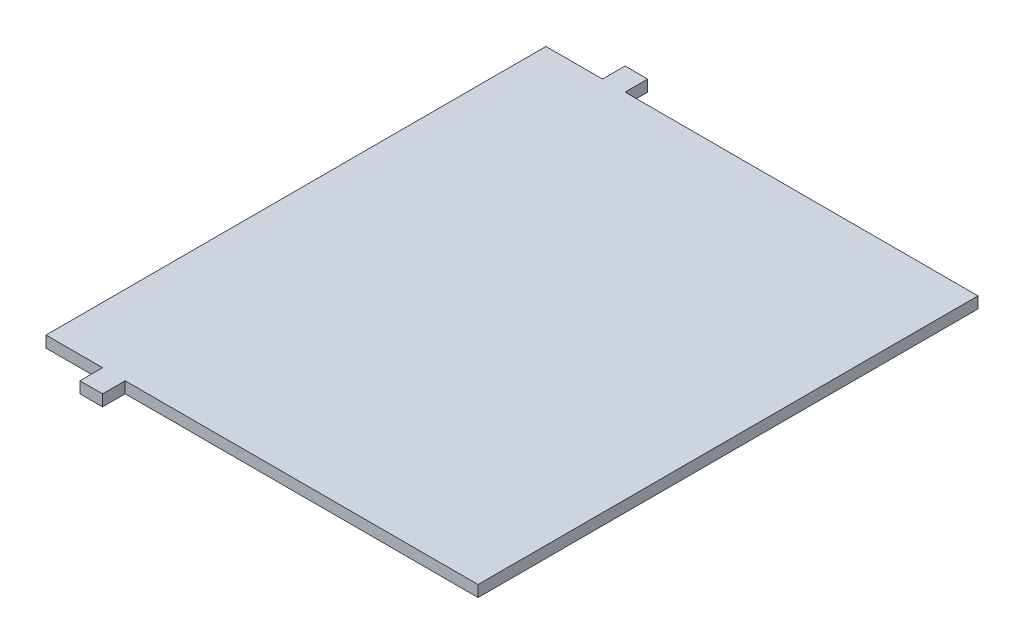
ISO-10303-21;
HEADER;
FILE_DESCRIPTION(('STEP AP214'),'2;1');
FILE_NAME('part.step','',(''),(''),'','','');
FILE_SCHEMA(('AUTOMOTIVE_DESIGN { 1 0 10303 214 1 1 1 1 }'));
ENDSEC;
DATA;
#1=APPLICATION_CONTEXT('core data for automotive mechanical design processes');
#2=APPLICATION_PROTOCOL_DEFINITION('international standard','automotive_design',2000,#1);
#3=PRODUCT_CONTEXT('',#1,'mechanical');
#4=PRODUCT('Part','Part','',(#3));
#5=PRODUCT_RELATED_PRODUCT_CATEGORY('part','',(#4));
#6=PRODUCT_DEFINITION_FORMATION('','',#4);
#7=PRODUCT_DEFINITION_CONTEXT('part definition',#1,'design');
#8=PRODUCT_DEFINITION('design','',#6,#7);
#9=PRODUCT_DEFINITION_SHAPE('','',#8);
#10=(LENGTH_UNIT() NAMED_UNIT(*) SI_UNIT(.MILLI.,.METRE.));
#11=(NAMED_UNIT(*) PLANE_ANGLE_UNIT() SI_UNIT($,.RADIAN.));
#12=(NAMED_UNIT(*) SI_UNIT($,.STERADIAN.) SOLID_ANGLE_UNIT());
#13=UNCERTAINTY_MEASURE_WITH_UNIT(LENGTH_MEASURE(1.E-05),#10,'distance_accuracy_value','');
#14=(GEOMETRIC_REPRESENTATION_CONTEXT(3) GLOBAL_UNCERTAINTY_ASSIGNED_CONTEXT((#13)) GLOBAL_UNIT_ASSIGNED_CONTEXT((#10,
#11,#12)) REPRESENTATION_CONTEXT('',''));
#15=CARTESIAN_POINT('',(0.,0.,0.));
#16=DIRECTION('',(0.,0.,1.));
#17=DIRECTION('',(1.,0.,0.));
#18=AXIS2_PLACEMENT_3D('',#15,#16,#17);
#19=CARTESIAN_POINT('',(-95.5,5.,-110.5));
#20=DIRECTION('',(0.,0.,1.));
#21=DIRECTION('',(1.,0.,0.));
#22=AXIS2_PLACEMENT_3D('',#19,#20,#21);
#23=PLANE('',#22);
#24=DIRECTION('',(-1.,0.,0.));
#25=VECTOR('',#24,1.);
#26=CARTESIAN_POINT('',(-95.5,5.,-110.5));
#27=LINE('',#26,#25);
#28=CARTESIAN_POINT('',(-70.5,5.,-110.5));
#29=VERTEX_POINT('',#28);
#30=CARTESIAN_POINT('',(-95.5,5.,-110.5));
#31=VERTEX_POINT('',#30);
#32=EDGE_CURVE('E204',#29,#31,#27,.T.);
#33=ORIENTED_EDGE('',*,*,#32,.F.);
#34=DIRECTION('',(0.,-1.,0.));
#35=VECTOR('',#34,1.);
#36=CARTESIAN_POINT('',(-70.5,5.,-110.5));
#37=LINE('',#36,#35);
#38=CARTESIAN_POINT('',(-70.5,0.,-110.5));
#39=VERTEX_POINT('',#38);
#40=EDGE_CURVE('E196',#29,#39,#37,.T.);
#41=ORIENTED_EDGE('',*,*,#40,.T.);
#42=DIRECTION('',(-1.,0.,0.));
#43=VECTOR('',#42,1.);
#44=CARTESIAN_POINT('',(-95.5,0.,-110.5));
#45=LINE('',#44,#43);
#46=CARTESIAN_POINT('',(-95.5,0.,-110.5));
#47=VERTEX_POINT('',#46);
#48=EDGE_CURVE('E142',#39,#47,#45,.T.);
#49=ORIENTED_EDGE('',*,*,#48,.T.);
#50=DIRECTION('',(0.,-1.,0.));
#51=VECTOR('',#50,1.);
#52=CARTESIAN_POINT('',(-95.5,5.,-110.5));
#53=LINE('',#52,#51);
#54=EDGE_CURVE('E52',#31,#47,#53,.T.);
#55=ORIENTED_EDGE('',*,*,#54,.F.);
#56=EDGE_LOOP('',(#33,#41,#49,#55));
#57=FACE_BOUND('',#56,.T.);
#58=ADVANCED_FACE('F43',(#57),#23,.F.);
#59=CARTESIAN_POINT('',(-95.5,5.,110.5));
#60=DIRECTION('',(0.,0.,-1.));
#61=DIRECTION('',(-1.,0.,0.));
#62=AXIS2_PLACEMENT_3D('',#59,#60,#61);
#63=PLANE('',#62);
#64=DIRECTION('',(1.,0.,0.));
#65=VECTOR('',#64,1.);
#66=CARTESIAN_POINT('',(-95.5,0.,110.5));
#67=LINE('',#66,#65);
#68=CARTESIAN_POINT('',(-95.5,0.,110.5));
#69=VERTEX_POINT('',#68);
#70=CARTESIAN_POINT('',(-70.5,0.,110.5));
#71=VERTEX_POINT('',#70);
#72=EDGE_CURVE('E205',#69,#71,#67,.T.);
#73=ORIENTED_EDGE('',*,*,#72,.T.);
#74=DIRECTION('',(0.,1.,0.));
#75=VECTOR('',#74,1.);
#76=CARTESIAN_POINT('',(-70.5,5.,110.5));
#77=LINE('',#76,#75);
#78=CARTESIAN_POINT('',(-70.5,5.,110.5));
#79=VERTEX_POINT('',#78);
#80=EDGE_CURVE('E192',#71,#79,#77,.T.);
#81=ORIENTED_EDGE('',*,*,#80,.T.);
#82=DIRECTION('',(1.,0.,0.));
#83=VECTOR('',#82,1.);
#84=CARTESIAN_POINT('',(-95.5,5.,110.5));
#85=LINE('',#84,#83);
#86=CARTESIAN_POINT('',(-95.5,5.,110.5));
#87=VERTEX_POINT('',#86);
#88=EDGE_CURVE('E214',#87,#79,#85,.T.);
#89=ORIENTED_EDGE('',*,*,#88,.F.);
#90=DIRECTION('',(0.,-1.,0.));
#91=VECTOR('',#90,1.);
#92=CARTESIAN_POINT('',(-95.5,5.,110.5));
#93=LINE('',#92,#91);
#94=EDGE_CURVE('E236',#87,#69,#93,.T.);
#95=ORIENTED_EDGE('',*,*,#94,.T.);
#96=EDGE_LOOP('',(#73,#81,#89,#95));
#97=FACE_BOUND('',#96,.T.);
#98=ADVANCED_FACE('F252',(#97),#63,.F.);
#99=CARTESIAN_POINT('',(95.5,5.,110.5));
#100=DIRECTION('',(-1.,0.,0.));
#101=DIRECTION('',(0.,0.,1.));
#102=AXIS2_PLACEMENT_3D('',#99,#100,#101);
#103=PLANE('',#102);
#104=DIRECTION('',(0.,0.,-1.));
#105=VECTOR('',#104,1.);
#106=CARTESIAN_POINT('',(95.5,0.,110.5));
#107=LINE('',#106,#105);
#108=CARTESIAN_POINT('',(95.5,0.,110.5));
#109=VERTEX_POINT('',#108);
#110=CARTESIAN_POINT('',(95.5,0.,-110.5));
#111=VERTEX_POINT('',#110);
#112=EDGE_CURVE('E199',#109,#111,#107,.T.);
#113=ORIENTED_EDGE('',*,*,#112,.T.);
#114=DIRECTION('',(0.,-1.,0.));
#115=VECTOR('',#114,1.);
#116=CARTESIAN_POINT('',(95.5,5.,-110.5));
#117=LINE('',#116,#115);
#118=CARTESIAN_POINT('',(95.5,5.,-110.5));
#119=VERTEX_POINT('',#118);
#120=EDGE_CURVE('E11',#119,#111,#117,.T.);
#121=ORIENTED_EDGE('',*,*,#120,.F.);
#122=DIRECTION('',(0.,0.,-1.));
#123=VECTOR('',#122,1.);
#124=CARTESIAN_POINT('',(95.5,5.,110.5));
#125=LINE('',#124,#123);
#126=CARTESIAN_POINT('',(95.5,5.,110.5));
#127=VERTEX_POINT('',#126);
#128=EDGE_CURVE('E200',#127,#119,#125,.T.);
#129=ORIENTED_EDGE('',*,*,#128,.F.);
#130=DIRECTION('',(0.,-1.,0.));
#131=VECTOR('',#130,1.);
#132=CARTESIAN_POINT('',(95.5,5.,110.5));
#133=LINE('',#132,#131);
#134=EDGE_CURVE('E218',#127,#109,#133,.T.);
#135=ORIENTED_EDGE('',*,*,#134,.T.);
#136=EDGE_LOOP('',(#113,#121,#129,#135));
#137=FACE_BOUND('',#136,.T.);
#138=ADVANCED_FACE('F45',(#137),#103,.F.);
#139=CARTESIAN_POINT('',(-60.5,0.,-110.5));
#140=VERTEX_POINT('',#139);
#141=EDGE_CURVE('E222',#111,#140,#45,.T.);
#142=ORIENTED_EDGE('',*,*,#141,.T.);
#143=DIRECTION('',(0.,1.,0.));
#144=VECTOR('',#143,1.);
#145=CARTESIAN_POINT('',(-60.5,5.,-110.5));
#146=LINE('',#145,#144);
#147=CARTESIAN_POINT('',(-60.5,5.,-110.5));
#148=VERTEX_POINT('',#147);
#149=EDGE_CURVE('E189',#140,#148,#146,.T.);
#150=ORIENTED_EDGE('',*,*,#149,.T.);
#151=EDGE_CURVE('E206',#119,#148,#27,.T.);
#152=ORIENTED_EDGE('',*,*,#151,.F.);
#153=ORIENTED_EDGE('',*,*,#120,.T.);
#154=EDGE_LOOP('',(#142,#150,#152,#153));
#155=FACE_BOUND('',#154,.T.);
#156=ADVANCED_FACE('F282',(#155),#23,.F.);
#157=CARTESIAN_POINT('',(-95.5,5.,110.5));
#158=DIRECTION('',(1.,0.,0.));
#159=DIRECTION('',(0.,0.,-1.));
#160=AXIS2_PLACEMENT_3D('',#157,#158,#159);
#161=PLANE('',#160);
#162=DIRECTION('',(0.,0.,1.));
#163=VECTOR('',#162,1.);
#164=CARTESIAN_POINT('',(-95.5,0.,110.5));
#165=LINE('',#164,#163);
#166=EDGE_CURVE('E226',#47,#69,#165,.T.);
#167=ORIENTED_EDGE('',*,*,#166,.T.);
#168=ORIENTED_EDGE('',*,*,#94,.F.);
#169=DIRECTION('',(0.,0.,1.));
#170=VECTOR('',#169,1.);
#171=CARTESIAN_POINT('',(-95.5,5.,110.5));
#172=LINE('',#171,#170);
#173=EDGE_CURVE('E210',#31,#87,#172,.T.);
#174=ORIENTED_EDGE('',*,*,#173,.F.);
#175=ORIENTED_EDGE('',*,*,#54,.T.);
#176=EDGE_LOOP('',(#167,#168,#174,#175));
#177=FACE_BOUND('',#176,.T.);
#178=ADVANCED_FACE('F244',(#177),#161,.F.);
#179=CARTESIAN_POINT('',(-60.5,5.,110.5));
#180=VERTEX_POINT('',#179);
#181=EDGE_CURVE('E213',#180,#127,#85,.T.);
#182=ORIENTED_EDGE('',*,*,#181,.F.);
#183=DIRECTION('',(0.,-1.,0.));
#184=VECTOR('',#183,1.);
#185=CARTESIAN_POINT('',(-60.5,5.,110.5));
#186=LINE('',#185,#184);
#187=CARTESIAN_POINT('',(-60.5,0.,110.5));
#188=VERTEX_POINT('',#187);
#189=EDGE_CURVE('E186',#180,#188,#186,.T.);
#190=ORIENTED_EDGE('',*,*,#189,.T.);
#191=EDGE_CURVE('E229',#188,#109,#67,.T.);
#192=ORIENTED_EDGE('',*,*,#191,.T.);
#193=ORIENTED_EDGE('',*,*,#134,.F.);
#194=EDGE_LOOP('',(#182,#190,#192,#193));
#195=FACE_BOUND('',#194,.T.);
#196=ADVANCED_FACE('F275',(#195),#63,.F.);
#197=CARTESIAN_POINT('',(0.,5.,0.));
#198=DIRECTION('',(0.,-1.,0.));
#199=DIRECTION('',(0.,0.,-1.));
#200=AXIS2_PLACEMENT_3D('',#197,#198,#199);
#201=PLANE('',#200);
#202=ORIENTED_EDGE('',*,*,#151,.T.);
#203=DIRECTION('',(0.,0.,-1.));
#204=VECTOR('',#203,1.);
#205=CARTESIAN_POINT('',(-60.5,5.,-120.5));
#206=LINE('',#205,#204);
#207=CARTESIAN_POINT('',(-60.5,5.,-120.5));
#208=VERTEX_POINT('',#207);
#209=EDGE_CURVE('E59',#148,#208,#206,.T.);
#210=ORIENTED_EDGE('',*,*,#209,.T.);
#211=DIRECTION('',(-1.,0.,0.));
#212=VECTOR('',#211,1.);
#213=CARTESIAN_POINT('',(-70.5,5.,-120.5));
#214=LINE('',#213,#212);
#215=CARTESIAN_POINT('',(-70.5,5.,-120.5));
#216=VERTEX_POINT('',#215);
#217=EDGE_CURVE('E273',#208,#216,#214,.T.);
#218=ORIENTED_EDGE('',*,*,#217,.T.);
#219=DIRECTION('',(0.,0.,1.));
#220=VECTOR('',#219,1.);
#221=CARTESIAN_POINT('',(-70.5,5.,-120.5));
#222=LINE('',#221,#220);
#223=EDGE_CURVE('E153',#216,#29,#222,.T.);
#224=ORIENTED_EDGE('',*,*,#223,.T.);
#225=ORIENTED_EDGE('',*,*,#32,.T.);
#226=ORIENTED_EDGE('',*,*,#173,.T.);
#227=ORIENTED_EDGE('',*,*,#88,.T.);
#228=CARTESIAN_POINT('',(-70.5,5.,120.5));
#229=VERTEX_POINT('',#228);
#230=EDGE_CURVE('E256',#79,#229,#222,.T.);
#231=ORIENTED_EDGE('',*,*,#230,.T.);
#232=DIRECTION('',(1.,0.,0.));
#233=VECTOR('',#232,1.);
#234=CARTESIAN_POINT('',(-70.5,5.,120.5));
#235=LINE('',#234,#233);
#236=CARTESIAN_POINT('',(-60.5,5.,120.5));
#237=VERTEX_POINT('',#236);
#238=EDGE_CURVE('E162',#229,#237,#235,.T.);
#239=ORIENTED_EDGE('',*,*,#238,.T.);
#240=EDGE_CURVE('E169',#237,#180,#206,.T.);
#241=ORIENTED_EDGE('',*,*,#240,.T.);
#242=ORIENTED_EDGE('',*,*,#181,.T.);
#243=ORIENTED_EDGE('',*,*,#128,.T.);
#244=EDGE_LOOP('',(#202,#210,#218,#224,#225,#226,#227,#231,#239,#241,#242,#243));
#245=FACE_BOUND('',#244,.T.);
#246=ADVANCED_FACE('F255',(#245),#201,.F.);
#247=CARTESIAN_POINT('',(0.,0.,0.));
#248=DIRECTION('',(0.,-1.,0.));
#249=DIRECTION('',(0.,0.,-1.));
#250=AXIS2_PLACEMENT_3D('',#247,#248,#249);
#251=PLANE('',#250);
#252=ORIENTED_EDGE('',*,*,#191,.F.);
#253=DIRECTION('',(0.,0.,-1.));
#254=VECTOR('',#253,1.);
#255=CARTESIAN_POINT('',(-60.5,0.,-120.5));
#256=LINE('',#255,#254);
#257=CARTESIAN_POINT('',(-60.5,0.,120.5));
#258=VERTEX_POINT('',#257);
#259=EDGE_CURVE('E67',#258,#188,#256,.T.);
#260=ORIENTED_EDGE('',*,*,#259,.F.);
#261=DIRECTION('',(1.,0.,0.));
#262=VECTOR('',#261,1.);
#263=CARTESIAN_POINT('',(-70.5,0.,120.5));
#264=LINE('',#263,#262);
#265=CARTESIAN_POINT('',(-70.5,0.,120.5));
#266=VERTEX_POINT('',#265);
#267=EDGE_CURVE('E174',#266,#258,#264,.T.);
#268=ORIENTED_EDGE('',*,*,#267,.F.);
#269=DIRECTION('',(0.,0.,1.));
#270=VECTOR('',#269,1.);
#271=CARTESIAN_POINT('',(-70.5,0.,-120.5));
#272=LINE('',#271,#270);
#273=EDGE_CURVE('E147',#71,#266,#272,.T.);
#274=ORIENTED_EDGE('',*,*,#273,.F.);
#275=ORIENTED_EDGE('',*,*,#72,.F.);
#276=ORIENTED_EDGE('',*,*,#166,.F.);
#277=ORIENTED_EDGE('',*,*,#48,.F.);
#278=CARTESIAN_POINT('',(-70.5,0.,-120.5));
#279=VERTEX_POINT('',#278);
#280=EDGE_CURVE('E133',#279,#39,#272,.T.);
#281=ORIENTED_EDGE('',*,*,#280,.F.);
#282=DIRECTION('',(-1.,0.,0.));
#283=VECTOR('',#282,1.);
#284=CARTESIAN_POINT('',(-70.5,0.,-120.5));
#285=LINE('',#284,#283);
#286=CARTESIAN_POINT('',(-60.5,0.,-120.5));
#287=VERTEX_POINT('',#286);
#288=EDGE_CURVE('E139',#287,#279,#285,.T.);
#289=ORIENTED_EDGE('',*,*,#288,.F.);
#290=EDGE_CURVE('E173',#140,#287,#256,.T.);
#291=ORIENTED_EDGE('',*,*,#290,.F.);
#292=ORIENTED_EDGE('',*,*,#141,.F.);
#293=ORIENTED_EDGE('',*,*,#112,.F.);
#294=EDGE_LOOP('',(#252,#260,#268,#274,#275,#276,#277,#281,#289,#291,#292,#293));
#295=FACE_BOUND('',#294,.T.);
#296=ADVANCED_FACE('F136',(#295),#251,.T.);
#297=CARTESIAN_POINT('',(-70.5,-241.207379654935,120.5));
#298=DIRECTION('',(0.,0.,1.));
#299=DIRECTION('',(1.,0.,0.));
#300=AXIS2_PLACEMENT_3D('',#297,#298,#299);
#301=PLANE('',#300);
#302=DIRECTION('',(0.,1.,0.));
#303=VECTOR('',#302,1.);
#304=CARTESIAN_POINT('',(-70.5,-241.207379654935,120.5));
#305=LINE('',#304,#303);
#306=EDGE_CURVE('E146',#266,#229,#305,.T.);
#307=ORIENTED_EDGE('',*,*,#306,.F.);
#308=ORIENTED_EDGE('',*,*,#267,.T.);
#309=DIRECTION('',(0.,1.,0.));
#310=VECTOR('',#309,1.);
#311=CARTESIAN_POINT('',(-60.5,-241.207379654935,120.5));
#312=LINE('',#311,#310);
#313=EDGE_CURVE('E177',#258,#237,#312,.T.);
#314=ORIENTED_EDGE('',*,*,#313,.T.);
#315=ORIENTED_EDGE('',*,*,#238,.F.);
#316=EDGE_LOOP('',(#307,#308,#314,#315));
#317=FACE_BOUND('',#316,.T.);
#318=ADVANCED_FACE('F267',(#317),#301,.T.);
#319=CARTESIAN_POINT('',(-60.5,-241.207379654935,-120.5));
#320=DIRECTION('',(1.,0.,0.));
#321=DIRECTION('',(0.,0.,-1.));
#322=AXIS2_PLACEMENT_3D('',#319,#320,#321);
#323=PLANE('',#322);
#324=ORIENTED_EDGE('',*,*,#189,.F.);
#325=ORIENTED_EDGE('',*,*,#240,.F.);
#326=ORIENTED_EDGE('',*,*,#313,.F.);
#327=ORIENTED_EDGE('',*,*,#259,.T.);
#328=EDGE_LOOP('',(#324,#325,#326,#327));
#329=FACE_BOUND('',#328,.T.);
#330=ADVANCED_FACE('F291',(#329),#323,.T.);
#331=CARTESIAN_POINT('',(-70.5,-241.207379654935,-120.5));
#332=DIRECTION('',(-1.,0.,0.));
#333=DIRECTION('',(0.,0.,1.));
#334=AXIS2_PLACEMENT_3D('',#331,#332,#333);
#335=PLANE('',#334);
#336=ORIENTED_EDGE('',*,*,#80,.F.);
#337=ORIENTED_EDGE('',*,*,#273,.T.);
#338=ORIENTED_EDGE('',*,*,#306,.T.);
#339=ORIENTED_EDGE('',*,*,#230,.F.);
#340=EDGE_LOOP('',(#336,#337,#338,#339));
#341=FACE_BOUND('',#340,.T.);
#342=ADVANCED_FACE('F263',(#341),#335,.T.);
#343=ORIENTED_EDGE('',*,*,#40,.F.);
#344=ORIENTED_EDGE('',*,*,#223,.F.);
#345=DIRECTION('',(0.,1.,0.));
#346=VECTOR('',#345,1.);
#347=CARTESIAN_POINT('',(-70.5,-241.207379654935,-120.5));
#348=LINE('',#347,#346);
#349=EDGE_CURVE('E150',#279,#216,#348,.T.);
#350=ORIENTED_EDGE('',*,*,#349,.F.);
#351=ORIENTED_EDGE('',*,*,#280,.T.);
#352=EDGE_LOOP('',(#343,#344,#350,#351));
#353=FACE_BOUND('',#352,.T.);
#354=ADVANCED_FACE('F151',(#353),#335,.T.);
#355=ORIENTED_EDGE('',*,*,#149,.F.);
#356=ORIENTED_EDGE('',*,*,#290,.T.);
#357=DIRECTION('',(0.,1.,0.));
#358=VECTOR('',#357,1.);
#359=CARTESIAN_POINT('',(-60.5,-241.207379654935,-120.5));
#360=LINE('',#359,#358);
#361=EDGE_CURVE('E160',#287,#208,#360,.T.);
#362=ORIENTED_EDGE('',*,*,#361,.T.);
#363=ORIENTED_EDGE('',*,*,#209,.F.);
#364=EDGE_LOOP('',(#355,#356,#362,#363));
#365=FACE_BOUND('',#364,.T.);
#366=ADVANCED_FACE('F283',(#365),#323,.T.);
#367=CARTESIAN_POINT('',(-70.5,-241.207379654935,-120.5));
#368=DIRECTION('',(0.,0.,-1.));
#369=DIRECTION('',(-1.,0.,0.));
#370=AXIS2_PLACEMENT_3D('',#367,#368,#369);
#371=PLANE('',#370);
#372=ORIENTED_EDGE('',*,*,#361,.F.);
#373=ORIENTED_EDGE('',*,*,#288,.T.);
#374=ORIENTED_EDGE('',*,*,#349,.T.);
#375=ORIENTED_EDGE('',*,*,#217,.F.);
#376=EDGE_LOOP('',(#372,#373,#374,#375));
#377=FACE_BOUND('',#376,.T.);
#378=ADVANCED_FACE('F159',(#377),#371,.T.);
#379=CLOSED_SHELL('',(#58,#98,#138,#156,#178,#196,#246,#296,#318,#330,#342,#354,#366,#378));
#380=MANIFOLD_SOLID_BREP('B2',#379);
#381=ADVANCED_BREP_SHAPE_REPRESENTATION('',(#18,#380),#14);
#382=SHAPE_DEFINITION_REPRESENTATION(#9,#381);
ENDSEC;
END-ISO-10303-21;
